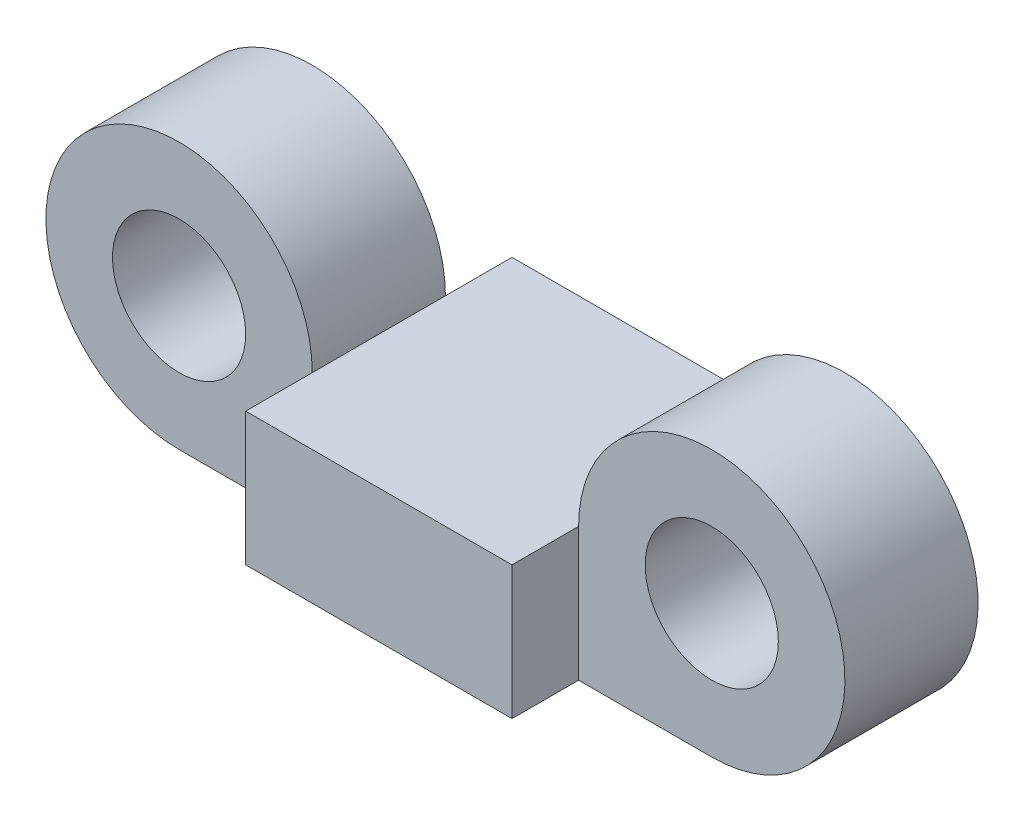
ISO-10303-21;
HEADER;
FILE_DESCRIPTION(('STEP AP214'),'2;1');
FILE_NAME('part.step','',(''),(''),'','','');
FILE_SCHEMA(('AUTOMOTIVE_DESIGN { 1 0 10303 214 1 1 1 1 }'));
ENDSEC;
DATA;
#1=APPLICATION_CONTEXT('core data for automotive mechanical design processes');
#2=APPLICATION_PROTOCOL_DEFINITION('international standard','automotive_design',2000,#1);
#3=PRODUCT_CONTEXT('',#1,'mechanical');
#4=PRODUCT('Part','Part','',(#3));
#5=PRODUCT_RELATED_PRODUCT_CATEGORY('part','',(#4));
#6=PRODUCT_DEFINITION_FORMATION('','',#4);
#7=PRODUCT_DEFINITION_CONTEXT('part definition',#1,'design');
#8=PRODUCT_DEFINITION('design','',#6,#7);
#9=PRODUCT_DEFINITION_SHAPE('','',#8);
#10=(LENGTH_UNIT() NAMED_UNIT(*) SI_UNIT(.MILLI.,.METRE.));
#11=(NAMED_UNIT(*) PLANE_ANGLE_UNIT() SI_UNIT($,.RADIAN.));
#12=(NAMED_UNIT(*) SI_UNIT($,.STERADIAN.) SOLID_ANGLE_UNIT());
#13=UNCERTAINTY_MEASURE_WITH_UNIT(LENGTH_MEASURE(1.E-05),#10,'distance_accuracy_value','');
#14=(GEOMETRIC_REPRESENTATION_CONTEXT(3) GLOBAL_UNCERTAINTY_ASSIGNED_CONTEXT((#13)) GLOBAL_UNIT_ASSIGNED_CONTEXT((#10,
#11,#12)) REPRESENTATION_CONTEXT('',''));
#15=CARTESIAN_POINT('',(0.,0.,0.));
#16=DIRECTION('',(0.,0.,1.));
#17=DIRECTION('',(1.,0.,0.));
#18=AXIS2_PLACEMENT_3D('',#15,#16,#17);
#19=CARTESIAN_POINT('',(0.,0.,5.));
#20=DIRECTION('',(0.,0.,1.));
#21=DIRECTION('',(1.,0.,0.));
#22=AXIS2_PLACEMENT_3D('',#19,#20,#21);
#23=PLANE('',#22);
#24=DIRECTION('',(0.,1.,0.));
#25=VECTOR('',#24,1.);
#26=CARTESIAN_POINT('',(15.,0.,5.));
#27=LINE('',#26,#25);
#28=CARTESIAN_POINT('',(15.,-5.,5.));
#29=VERTEX_POINT('',#28);
#30=CARTESIAN_POINT('',(15.,0.,5.));
#31=VERTEX_POINT('',#30);
#32=EDGE_CURVE('E55',#29,#31,#27,.T.);
#33=ORIENTED_EDGE('',*,*,#32,.F.);
#34=DIRECTION('',(1.,0.,0.));
#35=VECTOR('',#34,1.);
#36=CARTESIAN_POINT('',(0.,-5.,5.));
#37=LINE('',#36,#35);
#38=CARTESIAN_POINT('',(20.,-5.,5.));
#39=VERTEX_POINT('',#38);
#40=EDGE_CURVE('E198',#29,#39,#37,.T.);
#41=ORIENTED_EDGE('',*,*,#40,.T.);
#42=CARTESIAN_POINT('',(20.,0.,5.));
#43=DIRECTION('',(0.,0.,1.));
#44=DIRECTION('',(1.,0.,0.));
#45=AXIS2_PLACEMENT_3D('',#42,#43,#44);
#46=CIRCLE('',#45,5.);
#47=EDGE_CURVE('E201',#31,#39,#46,.F.);
#48=ORIENTED_EDGE('',*,*,#47,.F.);
#49=EDGE_LOOP('',(#33,#41,#48));
#50=FACE_BOUND('',#49,.T.);
#51=CARTESIAN_POINT('',(20.,0.,5.));
#52=DIRECTION('',(0.,0.,1.));
#53=DIRECTION('',(1.,0.,0.));
#54=AXIS2_PLACEMENT_3D('',#51,#52,#53);
#55=CIRCLE('',#54,2.5);
#56=CARTESIAN_POINT('',(22.5,0.,5.));
#57=VERTEX_POINT('',#56);
#58=EDGE_CURVE('E186',#57,#57,#55,.F.);
#59=ORIENTED_EDGE('',*,*,#58,.T.);
#60=EDGE_LOOP('',(#59));
#61=FACE_BOUND('',#60,.T.);
#62=ADVANCED_FACE('F39',(#50,#61),#23,.T.);
#63=CARTESIAN_POINT('',(0.,0.,0.));
#64=DIRECTION('',(0.,0.,1.));
#65=DIRECTION('',(1.,0.,0.));
#66=AXIS2_PLACEMENT_3D('',#63,#64,#65);
#67=PLANE('',#66);
#68=CARTESIAN_POINT('',(20.,0.,0.));
#69=DIRECTION('',(0.,0.,1.));
#70=DIRECTION('',(1.,0.,0.));
#71=AXIS2_PLACEMENT_3D('',#68,#69,#70);
#72=CIRCLE('',#71,2.5);
#73=CARTESIAN_POINT('',(22.5,0.,0.));
#74=VERTEX_POINT('',#73);
#75=EDGE_CURVE('E185',#74,#74,#72,.F.);
#76=ORIENTED_EDGE('',*,*,#75,.F.);
#77=EDGE_LOOP('',(#76));
#78=FACE_BOUND('',#77,.T.);
#79=DIRECTION('',(1.,0.,0.));
#80=VECTOR('',#79,1.);
#81=CARTESIAN_POINT('',(0.,-5.,0.));
#82=LINE('',#81,#80);
#83=CARTESIAN_POINT('',(15.,-5.,0.));
#84=VERTEX_POINT('',#83);
#85=CARTESIAN_POINT('',(20.,-5.,0.));
#86=VERTEX_POINT('',#85);
#87=EDGE_CURVE('E217',#84,#86,#82,.T.);
#88=ORIENTED_EDGE('',*,*,#87,.F.);
#89=DIRECTION('',(0.,1.,0.));
#90=VECTOR('',#89,1.);
#91=CARTESIAN_POINT('',(15.,0.,0.));
#92=LINE('',#91,#90);
#93=CARTESIAN_POINT('',(15.,0.,0.));
#94=VERTEX_POINT('',#93);
#95=EDGE_CURVE('E11',#84,#94,#92,.T.);
#96=ORIENTED_EDGE('',*,*,#95,.T.);
#97=CARTESIAN_POINT('',(20.,0.,0.));
#98=DIRECTION('',(0.,0.,1.));
#99=DIRECTION('',(1.,0.,0.));
#100=AXIS2_PLACEMENT_3D('',#97,#98,#99);
#101=CIRCLE('',#100,5.);
#102=EDGE_CURVE('E191',#94,#86,#101,.F.);
#103=ORIENTED_EDGE('',*,*,#102,.T.);
#104=EDGE_LOOP('',(#88,#96,#103));
#105=FACE_BOUND('',#104,.T.);
#106=ADVANCED_FACE('F264',(#78,#105),#67,.F.);
#107=CARTESIAN_POINT('',(0.,0.,5.));
#108=DIRECTION('',(0.,0.,-1.));
#109=DIRECTION('',(-1.,0.,0.));
#110=AXIS2_PLACEMENT_3D('',#107,#108,#109);
#111=CYLINDRICAL_SURFACE('',#110,5.);
#112=CARTESIAN_POINT('',(0.,0.,0.));
#113=DIRECTION('',(0.,0.,1.));
#114=DIRECTION('',(1.,0.,0.));
#115=AXIS2_PLACEMENT_3D('',#112,#113,#114);
#116=CIRCLE('',#115,5.);
#117=CARTESIAN_POINT('',(5.,0.,0.));
#118=VERTEX_POINT('',#117);
#119=CARTESIAN_POINT('',(0.,-5.,0.));
#120=VERTEX_POINT('',#119);
#121=EDGE_CURVE('E213',#118,#120,#116,.T.);
#122=ORIENTED_EDGE('',*,*,#121,.T.);
#123=DIRECTION('',(0.,0.,-1.));
#124=VECTOR('',#123,1.);
#125=CARTESIAN_POINT('',(0.,-5.,5.));
#126=LINE('',#125,#124);
#127=CARTESIAN_POINT('',(0.,-5.,5.));
#128=VERTEX_POINT('',#127);
#129=EDGE_CURVE('E235',#128,#120,#126,.T.);
#130=ORIENTED_EDGE('',*,*,#129,.F.);
#131=CARTESIAN_POINT('',(0.,0.,5.));
#132=DIRECTION('',(0.,0.,1.));
#133=DIRECTION('',(1.,0.,0.));
#134=AXIS2_PLACEMENT_3D('',#131,#132,#133);
#135=CIRCLE('',#134,5.);
#136=CARTESIAN_POINT('',(5.,0.,5.));
#137=VERTEX_POINT('',#136);
#138=EDGE_CURVE('E195',#137,#128,#135,.T.);
#139=ORIENTED_EDGE('',*,*,#138,.F.);
#140=DIRECTION('',(0.,0.,-1.));
#141=VECTOR('',#140,1.);
#142=CARTESIAN_POINT('',(5.,0.,5.));
#143=LINE('',#142,#141);
#144=EDGE_CURVE('E205',#137,#118,#143,.T.);
#145=ORIENTED_EDGE('',*,*,#144,.T.);
#146=EDGE_LOOP('',(#122,#130,#139,#145));
#147=FACE_BOUND('',#146,.T.);
#148=ADVANCED_FACE('F249',(#147),#111,.T.);
#149=CARTESIAN_POINT('',(0.,-5.,5.));
#150=DIRECTION('',(0.,1.,0.));
#151=DIRECTION('',(0.,0.,1.));
#152=AXIS2_PLACEMENT_3D('',#149,#150,#151);
#153=PLANE('',#152);
#154=CARTESIAN_POINT('',(5.,-5.,0.));
#155=VERTEX_POINT('',#154);
#156=EDGE_CURVE('E218',#120,#155,#82,.T.);
#157=ORIENTED_EDGE('',*,*,#156,.T.);
#158=DIRECTION('',(0.,0.,1.));
#159=VECTOR('',#158,1.);
#160=CARTESIAN_POINT('',(5.,-5.,7.5));
#161=LINE('',#160,#159);
#162=CARTESIAN_POINT('',(5.,-5.,-2.5));
#163=VERTEX_POINT('',#162);
#164=EDGE_CURVE('E144',#163,#155,#161,.T.);
#165=ORIENTED_EDGE('',*,*,#164,.F.);
#166=DIRECTION('',(-1.,0.,0.));
#167=VECTOR('',#166,1.);
#168=CARTESIAN_POINT('',(5.,-5.,-2.5));
#169=LINE('',#168,#167);
#170=CARTESIAN_POINT('',(15.,-5.,-2.5));
#171=VERTEX_POINT('',#170);
#172=EDGE_CURVE('E134',#171,#163,#169,.T.);
#173=ORIENTED_EDGE('',*,*,#172,.F.);
#174=DIRECTION('',(0.,0.,-1.));
#175=VECTOR('',#174,1.);
#176=CARTESIAN_POINT('',(15.,-5.,7.5));
#177=LINE('',#176,#175);
#178=EDGE_CURVE('E119',#84,#171,#177,.T.);
#179=ORIENTED_EDGE('',*,*,#178,.F.);
#180=ORIENTED_EDGE('',*,*,#87,.T.);
#181=DIRECTION('',(0.,0.,-1.));
#182=VECTOR('',#181,1.);
#183=CARTESIAN_POINT('',(20.,-5.,5.));
#184=LINE('',#183,#182);
#185=EDGE_CURVE('E231',#39,#86,#184,.T.);
#186=ORIENTED_EDGE('',*,*,#185,.F.);
#187=ORIENTED_EDGE('',*,*,#40,.F.);
#188=CARTESIAN_POINT('',(15.,-5.,7.5));
#189=VERTEX_POINT('',#188);
#190=EDGE_CURVE('E128',#189,#29,#177,.T.);
#191=ORIENTED_EDGE('',*,*,#190,.F.);
#192=DIRECTION('',(1.,0.,0.));
#193=VECTOR('',#192,1.);
#194=CARTESIAN_POINT('',(5.,-5.,7.5));
#195=LINE('',#194,#193);
#196=CARTESIAN_POINT('',(5.,-5.,7.5));
#197=VERTEX_POINT('',#196);
#198=EDGE_CURVE('E139',#197,#189,#195,.T.);
#199=ORIENTED_EDGE('',*,*,#198,.F.);
#200=CARTESIAN_POINT('',(5.,-5.,5.));
#201=VERTEX_POINT('',#200);
#202=EDGE_CURVE('E146',#201,#197,#161,.T.);
#203=ORIENTED_EDGE('',*,*,#202,.F.);
#204=EDGE_CURVE('E63',#128,#201,#37,.T.);
#205=ORIENTED_EDGE('',*,*,#204,.F.);
#206=ORIENTED_EDGE('',*,*,#129,.T.);
#207=EDGE_LOOP('',(#157,#165,#173,#179,#180,#186,#187,#191,#199,#203,#205,#206));
#208=FACE_BOUND('',#207,.T.);
#209=ADVANCED_FACE('F143',(#208),#153,.F.);
#210=CARTESIAN_POINT('',(20.,0.,5.));
#211=DIRECTION('',(0.,0.,-1.));
#212=DIRECTION('',(-1.,0.,0.));
#213=AXIS2_PLACEMENT_3D('',#210,#211,#212);
#214=CYLINDRICAL_SURFACE('',#213,5.);
#215=ORIENTED_EDGE('',*,*,#102,.F.);
#216=DIRECTION('',(0.,0.,-1.));
#217=VECTOR('',#216,1.);
#218=CARTESIAN_POINT('',(15.,0.,5.));
#219=LINE('',#218,#217);
#220=EDGE_CURVE('E227',#31,#94,#219,.T.);
#221=ORIENTED_EDGE('',*,*,#220,.F.);
#222=ORIENTED_EDGE('',*,*,#47,.T.);
#223=ORIENTED_EDGE('',*,*,#185,.T.);
#224=EDGE_LOOP('',(#215,#221,#222,#223));
#225=FACE_BOUND('',#224,.T.);
#226=ADVANCED_FACE('F271',(#225),#214,.T.);
#227=CARTESIAN_POINT('',(0.,0.,5.));
#228=DIRECTION('',(0.,0.,-1.));
#229=DIRECTION('',(-1.,0.,0.));
#230=AXIS2_PLACEMENT_3D('',#227,#228,#229);
#231=CYLINDRICAL_SURFACE('',#230,2.5);
#232=CARTESIAN_POINT('',(0.,0.,5.));
#233=DIRECTION('',(0.,0.,1.));
#234=DIRECTION('',(1.,0.,0.));
#235=AXIS2_PLACEMENT_3D('',#232,#233,#234);
#236=CIRCLE('',#235,2.5);
#237=CARTESIAN_POINT('',(2.5,0.,5.));
#238=VERTEX_POINT('',#237);
#239=EDGE_CURVE('E190',#238,#238,#236,.T.);
#240=ORIENTED_EDGE('',*,*,#239,.T.);
#241=EDGE_LOOP('',(#240));
#242=FACE_BOUND('',#241,.T.);
#243=CARTESIAN_POINT('',(0.,0.,0.));
#244=DIRECTION('',(0.,0.,1.));
#245=DIRECTION('',(1.,0.,0.));
#246=AXIS2_PLACEMENT_3D('',#243,#244,#245);
#247=CIRCLE('',#246,2.5);
#248=CARTESIAN_POINT('',(2.5,0.,0.));
#249=VERTEX_POINT('',#248);
#250=EDGE_CURVE('E209',#249,#249,#247,.T.);
#251=ORIENTED_EDGE('',*,*,#250,.F.);
#252=EDGE_LOOP('',(#251));
#253=FACE_BOUND('',#252,.T.);
#254=ADVANCED_FACE('F273',(#242,#253),#231,.F.);
#255=CARTESIAN_POINT('',(20.,0.,5.));
#256=DIRECTION('',(0.,0.,-1.));
#257=DIRECTION('',(-1.,0.,0.));
#258=AXIS2_PLACEMENT_3D('',#255,#256,#257);
#259=CYLINDRICAL_SURFACE('',#258,2.5);
#260=ORIENTED_EDGE('',*,*,#58,.F.);
#261=EDGE_LOOP('',(#260));
#262=FACE_BOUND('',#261,.T.);
#263=ORIENTED_EDGE('',*,*,#75,.T.);
#264=EDGE_LOOP('',(#263));
#265=FACE_BOUND('',#264,.T.);
#266=ADVANCED_FACE('F41',(#262,#265),#259,.F.);
#267=CARTESIAN_POINT('',(0.,0.,5.));
#268=DIRECTION('',(0.,-1.,0.));
#269=DIRECTION('',(0.,0.,-1.));
#270=AXIS2_PLACEMENT_3D('',#267,#268,#269);
#271=PLANE('',#270);
#272=ORIENTED_EDGE('',*,*,#220,.T.);
#273=DIRECTION('',(0.,0.,-1.));
#274=VECTOR('',#273,1.);
#275=CARTESIAN_POINT('',(15.,0.,7.5));
#276=LINE('',#275,#274);
#277=CARTESIAN_POINT('',(15.,0.,-2.5));
#278=VERTEX_POINT('',#277);
#279=EDGE_CURVE('E161',#94,#278,#276,.T.);
#280=ORIENTED_EDGE('',*,*,#279,.T.);
#281=DIRECTION('',(-1.,0.,0.));
#282=VECTOR('',#281,1.);
#283=CARTESIAN_POINT('',(5.,0.,-2.5));
#284=LINE('',#283,#282);
#285=CARTESIAN_POINT('',(5.,0.,-2.5));
#286=VERTEX_POINT('',#285);
#287=EDGE_CURVE('E136',#278,#286,#284,.T.);
#288=ORIENTED_EDGE('',*,*,#287,.T.);
#289=DIRECTION('',(0.,0.,1.));
#290=VECTOR('',#289,1.);
#291=CARTESIAN_POINT('',(5.,0.,7.5));
#292=LINE('',#291,#290);
#293=EDGE_CURVE('E165',#286,#118,#292,.T.);
#294=ORIENTED_EDGE('',*,*,#293,.T.);
#295=ORIENTED_EDGE('',*,*,#144,.F.);
#296=CARTESIAN_POINT('',(5.,0.,7.5));
#297=VERTEX_POINT('',#296);
#298=EDGE_CURVE('E164',#137,#297,#292,.T.);
#299=ORIENTED_EDGE('',*,*,#298,.T.);
#300=DIRECTION('',(1.,0.,0.));
#301=VECTOR('',#300,1.);
#302=CARTESIAN_POINT('',(5.,0.,7.5));
#303=LINE('',#302,#301);
#304=CARTESIAN_POINT('',(15.,0.,7.5));
#305=VERTEX_POINT('',#304);
#306=EDGE_CURVE('E129',#297,#305,#303,.T.);
#307=ORIENTED_EDGE('',*,*,#306,.T.);
#308=EDGE_CURVE('E157',#305,#31,#276,.T.);
#309=ORIENTED_EDGE('',*,*,#308,.T.);
#310=EDGE_LOOP('',(#272,#280,#288,#294,#295,#299,#307,#309));
#311=FACE_BOUND('',#310,.T.);
#312=ADVANCED_FACE('F252',(#311),#271,.F.);
#313=DIRECTION('',(0.,-1.,0.));
#314=VECTOR('',#313,1.);
#315=CARTESIAN_POINT('',(5.,0.,5.));
#316=LINE('',#315,#314);
#317=EDGE_CURVE('E174',#137,#201,#316,.T.);
#318=ORIENTED_EDGE('',*,*,#317,.F.);
#319=ORIENTED_EDGE('',*,*,#138,.T.);
#320=ORIENTED_EDGE('',*,*,#204,.T.);
#321=EDGE_LOOP('',(#318,#319,#320));
#322=FACE_BOUND('',#321,.T.);
#323=ORIENTED_EDGE('',*,*,#239,.F.);
#324=EDGE_LOOP('',(#323));
#325=FACE_BOUND('',#324,.T.);
#326=ADVANCED_FACE('F254',(#322,#325),#23,.T.);
#327=ORIENTED_EDGE('',*,*,#250,.T.);
#328=EDGE_LOOP('',(#327));
#329=FACE_BOUND('',#328,.T.);
#330=ORIENTED_EDGE('',*,*,#121,.F.);
#331=DIRECTION('',(0.,-1.,0.));
#332=VECTOR('',#331,1.);
#333=CARTESIAN_POINT('',(5.,0.,0.));
#334=LINE('',#333,#332);
#335=EDGE_CURVE('E48',#118,#155,#334,.T.);
#336=ORIENTED_EDGE('',*,*,#335,.T.);
#337=ORIENTED_EDGE('',*,*,#156,.F.);
#338=EDGE_LOOP('',(#330,#336,#337));
#339=FACE_BOUND('',#338,.T.);
#340=ADVANCED_FACE('F243',(#329,#339),#67,.F.);
#341=CARTESIAN_POINT('',(5.,-5.,-2.5));
#342=DIRECTION('',(0.,0.,-1.));
#343=DIRECTION('',(-1.,0.,0.));
#344=AXIS2_PLACEMENT_3D('',#341,#342,#343);
#345=PLANE('',#344);
#346=ORIENTED_EDGE('',*,*,#287,.F.);
#347=DIRECTION('',(0.,1.,0.));
#348=VECTOR('',#347,1.);
#349=CARTESIAN_POINT('',(15.,-5.,-2.5));
#350=LINE('',#349,#348);
#351=EDGE_CURVE('E122',#171,#278,#350,.T.);
#352=ORIENTED_EDGE('',*,*,#351,.F.);
#353=ORIENTED_EDGE('',*,*,#172,.T.);
#354=DIRECTION('',(0.,1.,0.));
#355=VECTOR('',#354,1.);
#356=CARTESIAN_POINT('',(5.,-5.,-2.5));
#357=LINE('',#356,#355);
#358=EDGE_CURVE('E138',#163,#286,#357,.T.);
#359=ORIENTED_EDGE('',*,*,#358,.T.);
#360=EDGE_LOOP('',(#346,#352,#353,#359));
#361=FACE_BOUND('',#360,.T.);
#362=ADVANCED_FACE('F133',(#361),#345,.T.);
#363=CARTESIAN_POINT('',(5.,-5.,7.5));
#364=DIRECTION('',(-1.,0.,0.));
#365=DIRECTION('',(0.,0.,1.));
#366=AXIS2_PLACEMENT_3D('',#363,#364,#365);
#367=PLANE('',#366);
#368=ORIENTED_EDGE('',*,*,#335,.F.);
#369=ORIENTED_EDGE('',*,*,#293,.F.);
#370=ORIENTED_EDGE('',*,*,#358,.F.);
#371=ORIENTED_EDGE('',*,*,#164,.T.);
#372=EDGE_LOOP('',(#368,#369,#370,#371));
#373=FACE_BOUND('',#372,.T.);
#374=ADVANCED_FACE('F404',(#373),#367,.T.);
#375=CARTESIAN_POINT('',(15.,-5.,7.5));
#376=DIRECTION('',(1.,0.,0.));
#377=DIRECTION('',(0.,0.,-1.));
#378=AXIS2_PLACEMENT_3D('',#375,#376,#377);
#379=PLANE('',#378);
#380=ORIENTED_EDGE('',*,*,#95,.F.);
#381=ORIENTED_EDGE('',*,*,#178,.T.);
#382=ORIENTED_EDGE('',*,*,#351,.T.);
#383=ORIENTED_EDGE('',*,*,#279,.F.);
#384=EDGE_LOOP('',(#380,#381,#382,#383));
#385=FACE_BOUND('',#384,.T.);
#386=ADVANCED_FACE('F121',(#385),#379,.T.);
#387=ORIENTED_EDGE('',*,*,#190,.T.);
#388=ORIENTED_EDGE('',*,*,#32,.T.);
#389=ORIENTED_EDGE('',*,*,#308,.F.);
#390=DIRECTION('',(0.,1.,0.));
#391=VECTOR('',#390,1.);
#392=CARTESIAN_POINT('',(15.,-5.,7.5));
#393=LINE('',#392,#391);
#394=EDGE_CURVE('E171',#189,#305,#393,.T.);
#395=ORIENTED_EDGE('',*,*,#394,.F.);
#396=EDGE_LOOP('',(#387,#388,#389,#395));
#397=FACE_BOUND('',#396,.T.);
#398=ADVANCED_FACE('F421',(#397),#379,.T.);
#399=CARTESIAN_POINT('',(5.,-5.,7.5));
#400=DIRECTION('',(0.,0.,1.));
#401=DIRECTION('',(1.,0.,0.));
#402=AXIS2_PLACEMENT_3D('',#399,#400,#401);
#403=PLANE('',#402);
#404=ORIENTED_EDGE('',*,*,#306,.F.);
#405=DIRECTION('',(0.,1.,0.));
#406=VECTOR('',#405,1.);
#407=CARTESIAN_POINT('',(5.,-5.,7.5));
#408=LINE('',#407,#406);
#409=EDGE_CURVE('E175',#197,#297,#408,.T.);
#410=ORIENTED_EDGE('',*,*,#409,.F.);
#411=ORIENTED_EDGE('',*,*,#198,.T.);
#412=ORIENTED_EDGE('',*,*,#394,.T.);
#413=EDGE_LOOP('',(#404,#410,#411,#412));
#414=FACE_BOUND('',#413,.T.);
#415=ADVANCED_FACE('F429',(#414),#403,.T.);
#416=ORIENTED_EDGE('',*,*,#298,.F.);
#417=ORIENTED_EDGE('',*,*,#317,.T.);
#418=ORIENTED_EDGE('',*,*,#202,.T.);
#419=ORIENTED_EDGE('',*,*,#409,.T.);
#420=EDGE_LOOP('',(#416,#417,#418,#419));
#421=FACE_BOUND('',#420,.T.);
#422=ADVANCED_FACE('F257',(#421),#367,.T.);
#423=CLOSED_SHELL('',(#62,#106,#148,#209,#226,#254,#266,#312,#326,#340,#362,#374,#386,#398,#415,#422));
#424=MANIFOLD_SOLID_BREP('B2',#423);
#425=ADVANCED_BREP_SHAPE_REPRESENTATION('',(#18,#424),#14);
#426=SHAPE_DEFINITION_REPRESENTATION(#9,#425);
ENDSEC;
END-ISO-10303-21;
